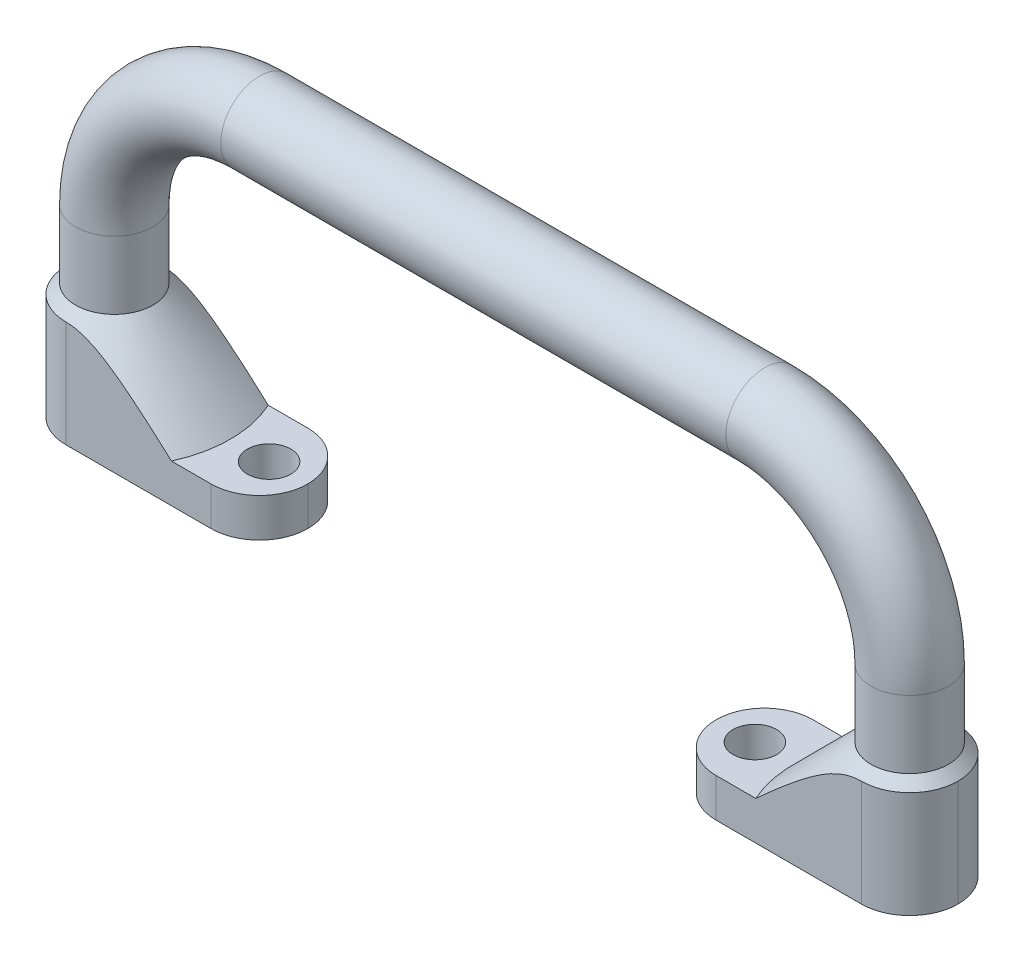
ISO-10303-21;
HEADER;
FILE_DESCRIPTION(('STEP AP214'),'2;1');
FILE_NAME('part.step','',(''),(''),'','','');
FILE_SCHEMA(('AUTOMOTIVE_DESIGN { 1 0 10303 214 1 1 1 1 }'));
ENDSEC;
DATA;
#1=APPLICATION_CONTEXT('core data for automotive mechanical design processes');
#2=APPLICATION_PROTOCOL_DEFINITION('international standard','automotive_design',2000,#1);
#3=PRODUCT_CONTEXT('',#1,'mechanical');
#4=PRODUCT('Part','Part','',(#3));
#5=PRODUCT_RELATED_PRODUCT_CATEGORY('part','',(#4));
#6=PRODUCT_DEFINITION_FORMATION('','',#4);
#7=PRODUCT_DEFINITION_CONTEXT('part definition',#1,'design');
#8=PRODUCT_DEFINITION('design','',#6,#7);
#9=PRODUCT_DEFINITION_SHAPE('','',#8);
#10=(LENGTH_UNIT() NAMED_UNIT(*) SI_UNIT(.MILLI.,.METRE.));
#11=(NAMED_UNIT(*) PLANE_ANGLE_UNIT() SI_UNIT($,.RADIAN.));
#12=(NAMED_UNIT(*) SI_UNIT($,.STERADIAN.) SOLID_ANGLE_UNIT());
#13=UNCERTAINTY_MEASURE_WITH_UNIT(LENGTH_MEASURE(1.E-05),#10,'distance_accuracy_value','');
#14=(GEOMETRIC_REPRESENTATION_CONTEXT(3) GLOBAL_UNCERTAINTY_ASSIGNED_CONTEXT((#13)) GLOBAL_UNIT_ASSIGNED_CONTEXT((#10,
#11,#12)) REPRESENTATION_CONTEXT('',''));
#15=CARTESIAN_POINT('',(0.,0.,0.));
#16=DIRECTION('',(0.,0.,1.));
#17=DIRECTION('',(1.,0.,0.));
#18=AXIS2_PLACEMENT_3D('',#15,#16,#17);
#19=CARTESIAN_POINT('',(-41.1,0.,0.));
#20=DIRECTION('',(0.,1.,0.));
#21=DIRECTION('',(0.,0.,1.));
#22=AXIS2_PLACEMENT_3D('',#19,#20,#21);
#23=CYLINDRICAL_SURFACE('',#22,4.);
#24=CARTESIAN_POINT('',(-41.1,8.00000000000006,0.));
#25=DIRECTION('',(0.,-1.,0.));
#26=DIRECTION('',(0.,0.,-1.));
#27=AXIS2_PLACEMENT_3D('',#24,#25,#26);
#28=CIRCLE('',#27,4.);
#29=CARTESIAN_POINT('',(-41.1,8.00000000000006,-4.));
#30=VERTEX_POINT('',#29);
#31=EDGE_CURVE('E246',#30,#30,#28,.F.);
#32=ORIENTED_EDGE('',*,*,#31,.T.);
#33=EDGE_LOOP('',(#32));
#34=FACE_BOUND('',#33,.T.);
#35=CARTESIAN_POINT('',(-41.1,15.,0.));
#36=DIRECTION('',(0.,-1.,0.));
#37=DIRECTION('',(0.,0.,1.));
#38=AXIS2_PLACEMENT_3D('',#35,#36,#37);
#39=CIRCLE('',#38,4.);
#40=CARTESIAN_POINT('',(-45.1,15.,0.));
#41=VERTEX_POINT('',#40);
#42=EDGE_CURVE('E334',#41,#41,#39,.T.);
#43=ORIENTED_EDGE('',*,*,#42,.T.);
#44=EDGE_LOOP('',(#43));
#45=FACE_BOUND('',#44,.T.);
#46=ADVANCED_FACE('F51',(#34,#45),#23,.T.);
#47=CARTESIAN_POINT('',(-26.1,15.,0.));
#48=DIRECTION('',(0.,0.,-1.));
#49=DIRECTION('',(-1.,0.,0.));
#50=AXIS2_PLACEMENT_3D('',#47,#48,#49);
#51=TOROIDAL_SURFACE('',#50,15.,4.);
#52=CARTESIAN_POINT('',(-26.1,30.,0.));
#53=DIRECTION('',(-1.,0.,0.));
#54=DIRECTION('',(0.,0.,1.));
#55=AXIS2_PLACEMENT_3D('',#52,#53,#54);
#56=CIRCLE('',#55,4.);
#57=CARTESIAN_POINT('',(-26.1,34.,0.));
#58=VERTEX_POINT('',#57);
#59=EDGE_CURVE('E344',#58,#58,#56,.T.);
#60=CARTESIAN_POINT('',(-26.1,15.,0.));
#61=DIRECTION('',(0.,0.,-1.));
#62=DIRECTION('',(-1.,0.,0.));
#63=AXIS2_PLACEMENT_3D('',#60,#61,#62);
#64=CIRCLE('',#63,19.);
#65=EDGE_CURVE('',#41,#58,#64,.T.);
#66=ORIENTED_EDGE('',*,*,#42,.F.);
#67=ORIENTED_EDGE('',*,*,#59,.T.);
#68=ORIENTED_EDGE('',*,*,#65,.T.);
#69=ORIENTED_EDGE('',*,*,#65,.F.);
#70=EDGE_LOOP('',(#66,#68,#67,#69));
#71=FACE_BOUND('',#70,.T.);
#72=ADVANCED_FACE('F362',(#71),#51,.T.);
#73=CARTESIAN_POINT('',(-26.1,30.,0.));
#74=DIRECTION('',(1.,0.,0.));
#75=DIRECTION('',(0.,0.,-1.));
#76=AXIS2_PLACEMENT_3D('',#73,#74,#75);
#77=CYLINDRICAL_SURFACE('',#76,4.);
#78=CARTESIAN_POINT('',(26.1,30.,0.));
#79=DIRECTION('',(-1.,0.,0.));
#80=DIRECTION('',(0.,0.,1.));
#81=AXIS2_PLACEMENT_3D('',#78,#79,#80);
#82=CIRCLE('',#81,4.);
#83=CARTESIAN_POINT('',(26.1,34.,0.));
#84=VERTEX_POINT('',#83);
#85=EDGE_CURVE('E191',#84,#84,#82,.T.);
#86=ORIENTED_EDGE('',*,*,#85,.T.);
#87=EDGE_LOOP('',(#86));
#88=FACE_BOUND('',#87,.T.);
#89=ORIENTED_EDGE('',*,*,#59,.F.);
#90=EDGE_LOOP('',(#89));
#91=FACE_BOUND('',#90,.T.);
#92=ADVANCED_FACE('F349',(#88,#91),#77,.T.);
#93=CARTESIAN_POINT('',(26.1,15.,0.));
#94=DIRECTION('',(0.,0.,-1.));
#95=DIRECTION('',(-1.,0.,0.));
#96=AXIS2_PLACEMENT_3D('',#93,#94,#95);
#97=TOROIDAL_SURFACE('',#96,15.,4.);
#98=CARTESIAN_POINT('',(41.1,15.,0.));
#99=DIRECTION('',(0.,1.,0.));
#100=DIRECTION('',(0.,0.,1.));
#101=AXIS2_PLACEMENT_3D('',#98,#99,#100);
#102=CIRCLE('',#101,4.);
#103=CARTESIAN_POINT('',(45.1,15.,0.));
#104=VERTEX_POINT('',#103);
#105=EDGE_CURVE('E187',#104,#104,#102,.T.);
#106=CARTESIAN_POINT('',(26.1,15.,0.));
#107=DIRECTION('',(0.,0.,-1.));
#108=DIRECTION('',(-1.,0.,0.));
#109=AXIS2_PLACEMENT_3D('',#106,#107,#108);
#110=CIRCLE('',#109,19.);
#111=EDGE_CURVE('',#84,#104,#110,.T.);
#112=ORIENTED_EDGE('',*,*,#85,.F.);
#113=ORIENTED_EDGE('',*,*,#105,.T.);
#114=ORIENTED_EDGE('',*,*,#111,.T.);
#115=ORIENTED_EDGE('',*,*,#111,.F.);
#116=EDGE_LOOP('',(#112,#114,#113,#115));
#117=FACE_BOUND('',#116,.T.);
#118=ADVANCED_FACE('F352',(#117),#97,.T.);
#119=CARTESIAN_POINT('',(41.1,15.,0.));
#120=DIRECTION('',(0.,-1.,0.));
#121=DIRECTION('',(0.,0.,-1.));
#122=AXIS2_PLACEMENT_3D('',#119,#120,#121);
#123=CYLINDRICAL_SURFACE('',#122,4.);
#124=CARTESIAN_POINT('',(41.1,8.00000000000013,0.));
#125=DIRECTION('',(0.,1.,0.));
#126=DIRECTION('',(0.,0.,1.));
#127=AXIS2_PLACEMENT_3D('',#124,#125,#126);
#128=CIRCLE('',#127,4.);
#129=CARTESIAN_POINT('',(41.1,8.00000000000013,4.));
#130=VERTEX_POINT('',#129);
#131=EDGE_CURVE('E230',#130,#130,#128,.T.);
#132=ORIENTED_EDGE('',*,*,#131,.T.);
#133=EDGE_LOOP('',(#132));
#134=FACE_BOUND('',#133,.T.);
#135=ORIENTED_EDGE('',*,*,#105,.F.);
#136=EDGE_LOOP('',(#135));
#137=FACE_BOUND('',#136,.T.);
#138=ADVANCED_FACE('F316',(#134,#137),#123,.T.);
#139=CARTESIAN_POINT('',(-46.1,-4.,-5.));
#140=DIRECTION('',(0.,0.,1.));
#141=DIRECTION('',(1.,0.,0.));
#142=AXIS2_PLACEMENT_3D('',#139,#140,#141);
#143=PLANE('',#142);
#144=DIRECTION('',(0.,1.,0.));
#145=VECTOR('',#144,1.);
#146=CARTESIAN_POINT('',(-41.1,-4.,-5.));
#147=LINE('',#146,#145);
#148=CARTESIAN_POINT('',(-41.1,-4.,-5.));
#149=VERTEX_POINT('',#148);
#150=CARTESIAN_POINT('',(-41.1,7.00000000000007,-5.));
#151=VERTEX_POINT('',#150);
#152=EDGE_CURVE('E68',#149,#151,#147,.T.);
#153=ORIENTED_EDGE('',*,*,#152,.T.);
#154=CARTESIAN_POINT('',(-41.1,7.00000000000007,-5.));
#155=CARTESIAN_POINT('',(-41.0230294122903,7.000006212588,-5.));
#156=CARTESIAN_POINT('',(-40.9460701463379,6.99822175880267,-5.));
#157=CARTESIAN_POINT('',(-40.7923264278984,6.99113002448274,-5.));
#158=CARTESIAN_POINT('',(-40.7155419486692,6.98582332509801,-5.));
#159=CARTESIAN_POINT('',(-40.4859880150245,6.96473858726,-5.));
#160=CARTESIAN_POINT('',(-40.3336680787708,6.94379537436098,-5.));
#161=CARTESIAN_POINT('',(-40.0342827305495,6.88976977000139,-5.));
#162=CARTESIAN_POINT('',(-39.8871726242152,6.85692905454721,-5.));
#163=CARTESIAN_POINT('',(-39.5957336733093,6.78051343459339,-5.));
#164=CARTESIAN_POINT('',(-39.4514062329731,6.73693325592776,-5.));
#165=CARTESIAN_POINT('',(-38.9967509087707,6.58360987916936,-5.));
#166=CARTESIAN_POINT('',(-38.6921976359858,6.4566212940877,-5.));
#167=CARTESIAN_POINT('',(-38.2460432625002,6.24430927336007,-5.));
#168=CARTESIAN_POINT('',(-38.098953274857,6.16980928597389,-5.));
#169=CARTESIAN_POINT('',(-37.8079510494583,6.01481711924215,-5.));
#170=CARTESIAN_POINT('',(-37.6640384455864,5.93432563499268,-5.));
#171=CARTESIAN_POINT('',(-37.3754574225301,5.76637313085827,-5.));
#172=CARTESIAN_POINT('',(-37.2308624789682,5.67878709092201,-5.));
#173=CARTESIAN_POINT('',(-36.9442935438527,5.49942984829532,-5.));
#174=CARTESIAN_POINT('',(-36.8023196158825,5.40765854426121,-5.));
#175=CARTESIAN_POINT('',(-36.5207906237873,5.22076070380414,-5.));
#176=CARTESIAN_POINT('',(-36.3812334871018,5.12563727865297,-5.));
#177=CARTESIAN_POINT('',(-36.1041069351578,4.93253318887578,-5.));
#178=CARTESIAN_POINT('',(-35.9665376048758,4.83455240263793,-5.));
#179=CARTESIAN_POINT('',(-35.5727747952042,4.54890566778743,-5.));
#180=CARTESIAN_POINT('',(-35.3187699689068,4.35822272814288,-5.));
#181=CARTESIAN_POINT('',(-34.8154861605266,3.97071556087546,-5.));
#182=CARTESIAN_POINT('',(-34.5662076086284,3.77389077849638,-5.));
#183=CARTESIAN_POINT('',(-34.0712083809918,3.3754805968975,-5.));
#184=CARTESIAN_POINT('',(-33.8254902922068,3.17389199122183,-5.));
#185=CARTESIAN_POINT('',(-33.3370231666966,2.76714897256046,-5.));
#186=CARTESIAN_POINT('',(-33.0942741870421,2.5619944912162,-5.));
#187=CARTESIAN_POINT('',(-32.6274485966861,2.1628000212204,-5.));
#188=CARTESIAN_POINT('',(-32.4032157855233,1.96894237334013,-5.));
#189=CARTESIAN_POINT('',(-31.9564752710347,1.57924540386185,-5.));
#190=CARTESIAN_POINT('',(-31.7339675909658,1.38340605562982,-5.));
#191=CARTESIAN_POINT('',(-31.2907343116188,0.990404794041007,-5.));
#192=CARTESIAN_POINT('',(-31.0700065020996,0.793245370557525,-5.));
#193=CARTESIAN_POINT('',(-30.6297807816042,0.397573990939565,-5.));
#194=CARTESIAN_POINT('',(-30.4102828254363,0.199062085104718,-5.));
#195=CARTESIAN_POINT('',(-30.1912878853641,0.,-5.));
#196=B_SPLINE_CURVE_WITH_KNOTS('',3,(#154,#155,#156,#157,#158,#159,#160,#161,#162,#163,#164,
#165,#166,#167,#168,#169,#170,#171,#172,#173,#174,#175,#176,#177,#178,#179,#180,#181,#182,#183,
#184,#185,#186,#187,#188,#189,#190,#191,#192,#193,#194,#195),.UNSPECIFIED.,.F.,.F.,(4,2,2,2,2,2,
2,2,2,2,2,2,2,2,2,2,2,2,2,2,4),(0.,0.23086945839446,0.461700834148446,0.922317600923813,
1.37405909624114,1.82602288613363,2.81309341218071,3.30768452274359,3.80221834309324,
4.30930023854729,4.81639441921608,5.32302973387091,5.82968664293459,6.78238295393183,
7.73516556684526,8.68860885582891,9.6420704427146,10.5312981282578,11.4205377809188,
12.3084132392308,13.1962558552354),.UNSPECIFIED.);
#197=CARTESIAN_POINT('',(-30.1912878853641,0.,-5.));
#198=VERTEX_POINT('',#197);
#199=EDGE_CURVE('E12',#151,#198,#196,.T.);
#200=ORIENTED_EDGE('',*,*,#199,.T.);
#201=DIRECTION('',(1.,0.,0.));
#202=VECTOR('',#201,1.);
#203=CARTESIAN_POINT('',(-46.1,0.,-5.));
#204=LINE('',#203,#202);
#205=CARTESIAN_POINT('',(-26.1,0.,-5.));
#206=VERTEX_POINT('',#205);
#207=EDGE_CURVE('E180',#198,#206,#204,.T.);
#208=ORIENTED_EDGE('',*,*,#207,.T.);
#209=DIRECTION('',(0.,1.,0.));
#210=VECTOR('',#209,1.);
#211=CARTESIAN_POINT('',(-26.1,-4.,-5.));
#212=LINE('',#211,#210);
#213=CARTESIAN_POINT('',(-26.1,-4.,-5.));
#214=VERTEX_POINT('',#213);
#215=EDGE_CURVE('E196',#206,#214,#212,.F.);
#216=ORIENTED_EDGE('',*,*,#215,.T.);
#217=DIRECTION('',(1.,0.,0.));
#218=VECTOR('',#217,1.);
#219=CARTESIAN_POINT('',(-46.1,-4.,-5.));
#220=LINE('',#219,#218);
#221=EDGE_CURVE('E179',#149,#214,#220,.T.);
#222=ORIENTED_EDGE('',*,*,#221,.F.);
#223=EDGE_LOOP('',(#153,#200,#208,#216,#222));
#224=FACE_BOUND('',#223,.T.);
#225=ADVANCED_FACE('F312',(#224),#143,.F.);
#226=CARTESIAN_POINT('',(-46.1,-4.,5.));
#227=DIRECTION('',(0.,0.,-1.));
#228=DIRECTION('',(-1.,0.,0.));
#229=AXIS2_PLACEMENT_3D('',#226,#227,#228);
#230=PLANE('',#229);
#231=DIRECTION('',(-1.,0.,0.));
#232=VECTOR('',#231,1.);
#233=CARTESIAN_POINT('',(-46.1,-4.,5.));
#234=LINE('',#233,#232);
#235=CARTESIAN_POINT('',(-26.1,-4.,5.));
#236=VERTEX_POINT('',#235);
#237=CARTESIAN_POINT('',(-41.1,-4.,5.));
#238=VERTEX_POINT('',#237);
#239=EDGE_CURVE('E163',#236,#238,#234,.T.);
#240=ORIENTED_EDGE('',*,*,#239,.F.);
#241=DIRECTION('',(0.,1.,0.));
#242=VECTOR('',#241,1.);
#243=CARTESIAN_POINT('',(-26.1,-4.,5.));
#244=LINE('',#243,#242);
#245=CARTESIAN_POINT('',(-26.1,0.,5.));
#246=VERTEX_POINT('',#245);
#247=EDGE_CURVE('E157',#236,#246,#244,.T.);
#248=ORIENTED_EDGE('',*,*,#247,.T.);
#249=DIRECTION('',(-1.,0.,0.));
#250=VECTOR('',#249,1.);
#251=CARTESIAN_POINT('',(-46.1,0.,5.));
#252=LINE('',#251,#250);
#253=CARTESIAN_POINT('',(-30.1912878853641,0.,5.));
#254=VERTEX_POINT('',#253);
#255=EDGE_CURVE('E161',#246,#254,#252,.T.);
#256=ORIENTED_EDGE('',*,*,#255,.T.);
#257=CARTESIAN_POINT('',(-30.1912878853641,0.,5.));
#258=CARTESIAN_POINT('',(-30.3844774102617,0.175610575889363,5.));
#259=CARTESIAN_POINT('',(-30.5780612268407,0.350789250330137,5.));
#260=CARTESIAN_POINT('',(-30.9661646305847,0.700114788725288,5.));
#261=CARTESIAN_POINT('',(-31.1606842371717,0.874261631095474,5.));
#262=CARTESIAN_POINT('',(-31.5509157488101,1.22145259831037,5.));
#263=CARTESIAN_POINT('',(-31.7466283009263,1.39449599648729,5.));
#264=CARTESIAN_POINT('',(-32.1393112905255,1.7391481010635,5.));
#265=CARTESIAN_POINT('',(-32.3362817197106,1.91075681690975,5.));
#266=CARTESIAN_POINT('',(-32.7332861690473,2.25362613635354,5.));
#267=CARTESIAN_POINT('',(-32.9333320918428,2.42487297292356,5.));
#268=CARTESIAN_POINT('',(-33.3352119121215,2.76525488095739,5.));
#269=CARTESIAN_POINT('',(-33.5370457943226,2.93438997044114,5.));
#270=CARTESIAN_POINT('',(-33.9428106224551,3.27003116528826,5.));
#271=CARTESIAN_POINT('',(-34.1467410563235,3.43653788854594,5.));
#272=CARTESIAN_POINT('',(-34.5571906265008,3.76632366407009,5.));
#273=CARTESIAN_POINT('',(-34.7637096891347,3.92960280785726,5.));
#274=CARTESIAN_POINT('',(-35.2084137535881,4.27417521162821,5.));
#275=CARTESIAN_POINT('',(-35.4470620109162,4.45487308282761,5.));
#276=CARTESIAN_POINT('',(-35.9295901750875,4.80929107784898,5.));
#277=CARTESIAN_POINT('',(-36.1734711195921,4.98300979768946,5.));
#278=CARTESIAN_POINT('',(-36.6680130995735,5.32093903576123,5.));
#279=CARTESIAN_POINT('',(-36.9186785243637,5.4851431717095,5.));
#280=CARTESIAN_POINT('',(-37.4284030330424,5.79997074370012,5.));
#281=CARTESIAN_POINT('',(-37.6874585953272,5.95059977973847,5.));
#282=CARTESIAN_POINT('',(-38.120197344882,6.1811501869295,5.));
#283=CARTESIAN_POINT('',(-38.2907610573371,6.26689992582624,5.));
#284=CARTESIAN_POINT('',(-38.6367147375484,6.42825547181651,5.));
#285=CARTESIAN_POINT('',(-38.8121055927343,6.50385939847199,5.));
#286=CARTESIAN_POINT('',(-39.1668557821157,6.64177900287504,5.));
#287=CARTESIAN_POINT('',(-39.346183850181,6.70417399970965,5.));
#288=CARTESIAN_POINT('',(-39.7095126716224,6.81314293359673,5.));
#289=CARTESIAN_POINT('',(-39.893509546456,6.85972956877261,5.));
#290=CARTESIAN_POINT('',(-40.2467658787609,6.93036725896863,5.));
#291=CARTESIAN_POINT('',(-40.4156596959833,6.95620565398697,5.));
#292=CARTESIAN_POINT('',(-40.670845055428,6.98233871207547,5.));
#293=CARTESIAN_POINT('',(-40.7565196023915,6.98894636424358,5.));
#294=CARTESIAN_POINT('',(-40.9281242977649,6.99778284671986,5.));
#295=CARTESIAN_POINT('',(-41.0140545267345,7.00001010777505,5.));
#296=CARTESIAN_POINT('',(-41.1,7.00000000000007,5.));
#297=B_SPLINE_CURVE_WITH_KNOTS('',3,(#257,#258,#259,#260,#261,#262,#263,#264,#265,#266,#267,
#268,#269,#270,#271,#272,#273,#274,#275,#276,#277,#278,#279,#280,#281,#282,#283,#284,#285,#286,
#287,#288,#289,#290,#291,#292,#293,#294,#295,#296),.UNSPECIFIED.,.F.,.F.,(4,2,2,2,2,2,2,2,2,2,2,
2,2,2,2,2,2,2,2,4),(0.,0.783232592101637,1.56648151067441,2.35020177817889,3.13391688104594,
3.92390149491755,4.71387936308292,5.50366866578477,6.29343554112993,7.19136312688662,
8.08947045151839,8.98817340427128,9.88650391097088,10.4589666566027,11.0315353571172,
11.6005616338825,12.1691297502474,12.6808561800538,12.9385427296536,13.1963215773543),.UNSPECIFIED.);
#298=CARTESIAN_POINT('',(-41.1,7.00000000000007,5.));
#299=VERTEX_POINT('',#298);
#300=EDGE_CURVE('E282',#254,#299,#297,.T.);
#301=ORIENTED_EDGE('',*,*,#300,.T.);
#302=DIRECTION('',(0.,1.,0.));
#303=VECTOR('',#302,1.);
#304=CARTESIAN_POINT('',(-41.1,-4.,5.));
#305=LINE('',#304,#303);
#306=EDGE_CURVE('E168',#299,#238,#305,.F.);
#307=ORIENTED_EDGE('',*,*,#306,.T.);
#308=EDGE_LOOP('',(#240,#248,#256,#301,#307));
#309=FACE_BOUND('',#308,.T.);
#310=ADVANCED_FACE('F159',(#309),#230,.F.);
#311=CARTESIAN_POINT('',(0.,-4.,0.));
#312=DIRECTION('',(0.,-1.,0.));
#313=DIRECTION('',(0.,0.,-1.));
#314=AXIS2_PLACEMENT_3D('',#311,#312,#313);
#315=PLANE('',#314);
#316=CARTESIAN_POINT('',(-25.0999999999999,-4.,0.));
#317=DIRECTION('',(0.,-1.,0.));
#318=DIRECTION('',(0.,0.,-1.));
#319=AXIS2_PLACEMENT_3D('',#316,#317,#318);
#320=CIRCLE('',#319,2.25);
#321=CARTESIAN_POINT('',(-25.0999999999999,-4.,-2.25));
#322=VERTEX_POINT('',#321);
#323=EDGE_CURVE('E600',#322,#322,#320,.T.);
#324=ORIENTED_EDGE('',*,*,#323,.F.);
#325=EDGE_LOOP('',(#324));
#326=FACE_BOUND('',#325,.T.);
#327=ORIENTED_EDGE('',*,*,#221,.T.);
#328=CARTESIAN_POINT('',(-26.1,-4.,0.));
#329=DIRECTION('',(0.,-1.,0.));
#330=DIRECTION('',(0.,0.,-1.));
#331=AXIS2_PLACEMENT_3D('',#328,#329,#330);
#332=CIRCLE('',#331,5.);
#333=CARTESIAN_POINT('',(-21.1,-4.,0.));
#334=VERTEX_POINT('',#333);
#335=EDGE_CURVE('E205',#214,#334,#332,.T.);
#336=ORIENTED_EDGE('',*,*,#335,.T.);
#337=CARTESIAN_POINT('',(-26.1,-4.,0.));
#338=DIRECTION('',(0.,-1.,0.));
#339=DIRECTION('',(0.,0.,-1.));
#340=AXIS2_PLACEMENT_3D('',#337,#338,#339);
#341=CIRCLE('',#340,5.);
#342=EDGE_CURVE('E203',#334,#236,#341,.T.);
#343=ORIENTED_EDGE('',*,*,#342,.T.);
#344=ORIENTED_EDGE('',*,*,#239,.T.);
#345=CARTESIAN_POINT('',(-41.1,-4.,0.));
#346=DIRECTION('',(0.,-1.,0.));
#347=DIRECTION('',(0.,0.,-1.));
#348=AXIS2_PLACEMENT_3D('',#345,#346,#347);
#349=CIRCLE('',#348,5.);
#350=CARTESIAN_POINT('',(-46.1,-4.,0.));
#351=VERTEX_POINT('',#350);
#352=EDGE_CURVE('E199',#238,#351,#349,.T.);
#353=ORIENTED_EDGE('',*,*,#352,.T.);
#354=CARTESIAN_POINT('',(-41.1,-4.,0.));
#355=DIRECTION('',(0.,-1.,0.));
#356=DIRECTION('',(0.,0.,-1.));
#357=AXIS2_PLACEMENT_3D('',#354,#355,#356);
#358=CIRCLE('',#357,5.);
#359=EDGE_CURVE('E201',#351,#149,#358,.T.);
#360=ORIENTED_EDGE('',*,*,#359,.T.);
#361=EDGE_LOOP('',(#327,#336,#343,#344,#353,#360));
#362=FACE_BOUND('',#361,.T.);
#363=ADVANCED_FACE('F303',(#326,#362),#315,.T.);
#364=CARTESIAN_POINT('',(0.,0.,0.));
#365=DIRECTION('',(0.,-1.,0.));
#366=DIRECTION('',(0.,0.,-1.));
#367=AXIS2_PLACEMENT_3D('',#364,#365,#366);
#368=PLANE('',#367);
#369=CARTESIAN_POINT('',(-25.0999999999999,0.,0.));
#370=DIRECTION('',(0.,1.,0.));
#371=DIRECTION('',(0.,0.,1.));
#372=AXIS2_PLACEMENT_3D('',#369,#370,#371);
#373=CIRCLE('',#372,2.25);
#374=CARTESIAN_POINT('',(-25.0999999999999,0.,2.25));
#375=VERTEX_POINT('',#374);
#376=EDGE_CURVE('E603',#375,#375,#373,.T.);
#377=ORIENTED_EDGE('',*,*,#376,.F.);
#378=EDGE_LOOP('',(#377));
#379=FACE_BOUND('',#378,.T.);
#380=ORIENTED_EDGE('',*,*,#207,.F.);
#381=CARTESIAN_POINT('',(-41.1,0.,0.));
#382=DIRECTION('',(0.,-1.,0.));
#383=DIRECTION('',(0.,0.,-1.));
#384=AXIS2_PLACEMENT_3D('',#381,#382,#383);
#385=CIRCLE('',#384,12.0000000000001);
#386=EDGE_CURVE('E178',#198,#254,#385,.T.);
#387=ORIENTED_EDGE('',*,*,#386,.T.);
#388=ORIENTED_EDGE('',*,*,#255,.F.);
#389=CARTESIAN_POINT('',(-26.1,0.,0.));
#390=DIRECTION('',(0.,-1.,0.));
#391=DIRECTION('',(0.,0.,-1.));
#392=AXIS2_PLACEMENT_3D('',#389,#390,#391);
#393=CIRCLE('',#392,5.);
#394=CARTESIAN_POINT('',(-21.1,0.,0.));
#395=VERTEX_POINT('',#394);
#396=EDGE_CURVE('E175',#246,#395,#393,.F.);
#397=ORIENTED_EDGE('',*,*,#396,.T.);
#398=CARTESIAN_POINT('',(-26.1,0.,0.));
#399=DIRECTION('',(0.,-1.,0.));
#400=DIRECTION('',(0.,0.,-1.));
#401=AXIS2_PLACEMENT_3D('',#398,#399,#400);
#402=CIRCLE('',#401,5.);
#403=EDGE_CURVE('E186',#395,#206,#402,.F.);
#404=ORIENTED_EDGE('',*,*,#403,.T.);
#405=EDGE_LOOP('',(#380,#387,#388,#397,#404));
#406=FACE_BOUND('',#405,.T.);
#407=ADVANCED_FACE('F173',(#379,#406),#368,.F.);
#408=CARTESIAN_POINT('',(21.1,-4.,-5.));
#409=DIRECTION('',(0.,0.,1.));
#410=DIRECTION('',(1.,0.,0.));
#411=AXIS2_PLACEMENT_3D('',#408,#409,#410);
#412=PLANE('',#411);
#413=DIRECTION('',(1.,0.,0.));
#414=VECTOR('',#413,1.);
#415=CARTESIAN_POINT('',(21.1,-4.,-5.));
#416=LINE('',#415,#414);
#417=CARTESIAN_POINT('',(26.1,-4.,-5.));
#418=VERTEX_POINT('',#417);
#419=CARTESIAN_POINT('',(41.1,-4.,-5.));
#420=VERTEX_POINT('',#419);
#421=EDGE_CURVE('E337',#418,#420,#416,.T.);
#422=ORIENTED_EDGE('',*,*,#421,.F.);
#423=DIRECTION('',(0.,1.,0.));
#424=VECTOR('',#423,1.);
#425=CARTESIAN_POINT('',(26.1,-4.,-5.));
#426=LINE('',#425,#424);
#427=CARTESIAN_POINT('',(26.1,0.,-5.));
#428=VERTEX_POINT('',#427);
#429=EDGE_CURVE('E210',#418,#428,#426,.T.);
#430=ORIENTED_EDGE('',*,*,#429,.T.);
#431=DIRECTION('',(1.,0.,0.));
#432=VECTOR('',#431,1.);
#433=CARTESIAN_POINT('',(21.1,0.,-5.));
#434=LINE('',#433,#432);
#435=CARTESIAN_POINT('',(30.1912878853642,0.,-5.));
#436=VERTEX_POINT('',#435);
#437=EDGE_CURVE('E340',#428,#436,#434,.T.);
#438=ORIENTED_EDGE('',*,*,#437,.T.);
#439=CARTESIAN_POINT('',(30.1912878853642,0.,-5.));
#440=CARTESIAN_POINT('',(30.3844774102618,0.175610575889364,-5.));
#441=CARTESIAN_POINT('',(30.5780612268408,0.350789250330137,-5.));
#442=CARTESIAN_POINT('',(30.9661646305847,0.700114788725284,-5.));
#443=CARTESIAN_POINT('',(31.1606842371717,0.874261631095467,-5.));
#444=CARTESIAN_POINT('',(31.5509157488102,1.22145259831036,-5.));
#445=CARTESIAN_POINT('',(31.7466283009264,1.39449599648729,-5.));
#446=CARTESIAN_POINT('',(32.1393112905256,1.7391481010635,-5.));
#447=CARTESIAN_POINT('',(32.3362817197106,1.91075681690974,-5.));
#448=CARTESIAN_POINT('',(32.7332861690474,2.25362613635353,-5.));
#449=CARTESIAN_POINT('',(32.9333320918428,2.42487297292355,-5.));
#450=CARTESIAN_POINT('',(33.3352119121216,2.76525488095737,-5.));
#451=CARTESIAN_POINT('',(33.5370457943226,2.93438997044112,-5.));
#452=CARTESIAN_POINT('',(33.9428106224551,3.27003116528824,-5.));
#453=CARTESIAN_POINT('',(34.1467410563235,3.43653788854593,-5.));
#454=CARTESIAN_POINT('',(34.5571906265007,3.76632366407007,-5.));
#455=CARTESIAN_POINT('',(34.7637096891347,3.92960280785725,-5.));
#456=CARTESIAN_POINT('',(35.2084137535881,4.27417521162819,-5.));
#457=CARTESIAN_POINT('',(35.4470620109162,4.45487308282759,-5.));
#458=CARTESIAN_POINT('',(35.9295901750875,4.80929107784896,-5.));
#459=CARTESIAN_POINT('',(36.173471119592,4.98300979768945,-5.));
#460=CARTESIAN_POINT('',(36.6680130995735,5.32093903576122,-5.));
#461=CARTESIAN_POINT('',(36.9186785243636,5.48514317170949,-5.));
#462=CARTESIAN_POINT('',(37.4284030330424,5.79997074370012,-5.));
#463=CARTESIAN_POINT('',(37.6874585953272,5.95059977973846,-5.));
#464=CARTESIAN_POINT('',(38.120197344882,6.1811501869295,-5.));
#465=CARTESIAN_POINT('',(38.290761057337,6.26689992582624,-5.));
#466=CARTESIAN_POINT('',(38.6367147375483,6.42825547181651,-5.));
#467=CARTESIAN_POINT('',(38.8121055927342,6.503859398472,-5.));
#468=CARTESIAN_POINT('',(39.1668557821157,6.64177900287506,-5.));
#469=CARTESIAN_POINT('',(39.346183850181,6.70417399970967,-5.));
#470=CARTESIAN_POINT('',(39.7095126716223,6.81314293359676,-5.));
#471=CARTESIAN_POINT('',(39.8935095464559,6.85972956877264,-5.));
#472=CARTESIAN_POINT('',(40.2467658787608,6.93036725896867,-5.));
#473=CARTESIAN_POINT('',(40.4156596959832,6.95620565398701,-5.));
#474=CARTESIAN_POINT('',(40.6708450554279,6.98233871207552,-5.));
#475=CARTESIAN_POINT('',(40.7565196023915,6.98894636424363,-5.));
#476=CARTESIAN_POINT('',(40.9281242977649,6.99778284671991,-5.));
#477=CARTESIAN_POINT('',(41.0140545267345,7.0000101077751,-5.));
#478=CARTESIAN_POINT('',(41.1,7.00000000000012,-5.));
#479=B_SPLINE_CURVE_WITH_KNOTS('',3,(#439,#440,#441,#442,#443,#444,#445,#446,#447,#448,#449,
#450,#451,#452,#453,#454,#455,#456,#457,#458,#459,#460,#461,#462,#463,#464,#465,#466,#467,#468,
#469,#470,#471,#472,#473,#474,#475,#476,#477,#478),.UNSPECIFIED.,.F.,.F.,(4,2,2,2,2,2,2,2,2,2,2,
2,2,2,2,2,2,2,2,4),(0.,0.783232592101622,1.56648151067439,2.35020177817886,3.1339168810459,
3.92390149491749,4.71387936308284,5.50366866578468,6.29343554112983,7.19136312688652,
8.08947045151827,8.98817340427116,9.88650391097075,10.4589666566026,11.0315353571171,
11.6005616338824,12.1691297502472,12.6808561800537,12.9385427296535,13.1963215773543),.UNSPECIFIED.);
#480=CARTESIAN_POINT('',(41.1,7.00000000000012,-5.));
#481=VERTEX_POINT('',#480);
#482=EDGE_CURVE('E249',#436,#481,#479,.T.);
#483=ORIENTED_EDGE('',*,*,#482,.T.);
#484=DIRECTION('',(0.,1.,0.));
#485=VECTOR('',#484,1.);
#486=CARTESIAN_POINT('',(41.1,-4.,-5.));
#487=LINE('',#486,#485);
#488=EDGE_CURVE('E167',#481,#420,#487,.F.);
#489=ORIENTED_EDGE('',*,*,#488,.T.);
#490=EDGE_LOOP('',(#422,#430,#438,#483,#489));
#491=FACE_BOUND('',#490,.T.);
#492=ADVANCED_FACE('F259',(#491),#412,.F.);
#493=CARTESIAN_POINT('',(21.1,-4.,5.));
#494=DIRECTION('',(0.,0.,-1.));
#495=DIRECTION('',(-1.,0.,0.));
#496=AXIS2_PLACEMENT_3D('',#493,#494,#495);
#497=PLANE('',#496);
#498=DIRECTION('',(0.,1.,0.));
#499=VECTOR('',#498,1.);
#500=CARTESIAN_POINT('',(41.1,-4.,5.));
#501=LINE('',#500,#499);
#502=CARTESIAN_POINT('',(41.1,-4.,5.));
#503=VERTEX_POINT('',#502);
#504=CARTESIAN_POINT('',(41.1,7.00000000000012,5.));
#505=VERTEX_POINT('',#504);
#506=EDGE_CURVE('E226',#503,#505,#501,.T.);
#507=ORIENTED_EDGE('',*,*,#506,.T.);
#508=CARTESIAN_POINT('',(41.1,7.00000000000012,5.));
#509=CARTESIAN_POINT('',(41.0230294122903,7.00000621258805,5.));
#510=CARTESIAN_POINT('',(40.946070146338,6.99822175880272,5.));
#511=CARTESIAN_POINT('',(40.7923264278985,6.9911300244828,5.));
#512=CARTESIAN_POINT('',(40.7155419486693,6.98582332509807,5.));
#513=CARTESIAN_POINT('',(40.4859880150245,6.96473858726005,5.));
#514=CARTESIAN_POINT('',(40.3336680787708,6.94379537436104,5.));
#515=CARTESIAN_POINT('',(40.0342827305496,6.88976977000144,5.));
#516=CARTESIAN_POINT('',(39.8871726242152,6.85692905454727,5.));
#517=CARTESIAN_POINT('',(39.5957336733093,6.78051343459345,5.));
#518=CARTESIAN_POINT('',(39.4514062329732,6.73693325592782,5.));
#519=CARTESIAN_POINT('',(38.9967509087707,6.58360987916942,5.));
#520=CARTESIAN_POINT('',(38.6921976359858,6.45662129408777,5.));
#521=CARTESIAN_POINT('',(38.2460432625003,6.24430927336014,5.));
#522=CARTESIAN_POINT('',(38.0989532748571,6.16980928597396,5.));
#523=CARTESIAN_POINT('',(37.8079510494584,6.01481711924223,5.));
#524=CARTESIAN_POINT('',(37.6640384455865,5.93432563499276,5.));
#525=CARTESIAN_POINT('',(37.3754574225302,5.76637313085836,5.));
#526=CARTESIAN_POINT('',(37.2308624789683,5.67878709092209,5.));
#527=CARTESIAN_POINT('',(36.9442935438528,5.49942984829542,5.));
#528=CARTESIAN_POINT('',(36.8023196158826,5.40765854426131,5.));
#529=CARTESIAN_POINT('',(36.5207906237874,5.22076070380424,5.));
#530=CARTESIAN_POINT('',(36.3812334871019,5.12563727865308,5.));
#531=CARTESIAN_POINT('',(36.1041069351579,4.93253318887589,5.));
#532=CARTESIAN_POINT('',(35.9665376048759,4.83455240263804,5.));
#533=CARTESIAN_POINT('',(35.5727747952043,4.54890566778754,5.));
#534=CARTESIAN_POINT('',(35.3187699689069,4.35822272814299,5.));
#535=CARTESIAN_POINT('',(34.8154861605268,3.97071556087556,5.));
#536=CARTESIAN_POINT('',(34.5662076086285,3.77389077849647,5.));
#537=CARTESIAN_POINT('',(34.0712083809919,3.37548059689759,5.));
#538=CARTESIAN_POINT('',(33.8254902922069,3.17389199122191,5.));
#539=CARTESIAN_POINT('',(33.3370231666967,2.76714897256053,5.));
#540=CARTESIAN_POINT('',(33.0942741870423,2.56199449121627,5.));
#541=CARTESIAN_POINT('',(32.6274485966862,2.16280002122046,5.));
#542=CARTESIAN_POINT('',(32.4032157855234,1.96894237334018,5.));
#543=CARTESIAN_POINT('',(31.9564752710348,1.57924540386189,5.));
#544=CARTESIAN_POINT('',(31.7339675909659,1.38340605562985,5.));
#545=CARTESIAN_POINT('',(31.290734311619,0.990404794041031,5.));
#546=CARTESIAN_POINT('',(31.0700065020997,0.793245370557546,5.));
#547=CARTESIAN_POINT('',(30.6297807816043,0.397573990939578,5.));
#548=CARTESIAN_POINT('',(30.4102828254364,0.199062085104724,5.));
#549=CARTESIAN_POINT('',(30.1912878853642,0.,5.));
#550=B_SPLINE_CURVE_WITH_KNOTS('',3,(#508,#509,#510,#511,#512,#513,#514,#515,#516,#517,#518,
#519,#520,#521,#522,#523,#524,#525,#526,#527,#528,#529,#530,#531,#532,#533,#534,#535,#536,#537,
#538,#539,#540,#541,#542,#543,#544,#545,#546,#547,#548,#549),.UNSPECIFIED.,.F.,.F.,(4,2,2,2,2,2,
2,2,2,2,2,2,2,2,2,2,2,2,2,2,4),(0.,0.230869458394453,0.461700834148432,0.922317600923785,
1.3740590962411,1.8260228861336,2.81309341218065,3.30768452274351,3.80221834309313,
4.30930023854717,4.81639441921595,5.32302973387077,5.82968664293442,6.78238295393168,
7.73516556684513,8.68860885582878,9.6420704427145,10.5312981282577,11.4205377809187,
12.3084132392307,13.1962558552354),.UNSPECIFIED.);
#551=CARTESIAN_POINT('',(30.1912878853642,0.,5.));
#552=VERTEX_POINT('',#551);
#553=EDGE_CURVE('E276',#505,#552,#550,.T.);
#554=ORIENTED_EDGE('',*,*,#553,.T.);
#555=DIRECTION('',(-1.,0.,0.));
#556=VECTOR('',#555,1.);
#557=CARTESIAN_POINT('',(21.1,0.,5.));
#558=LINE('',#557,#556);
#559=CARTESIAN_POINT('',(26.1,0.,5.));
#560=VERTEX_POINT('',#559);
#561=EDGE_CURVE('E610',#552,#560,#558,.T.);
#562=ORIENTED_EDGE('',*,*,#561,.T.);
#563=DIRECTION('',(0.,1.,0.));
#564=VECTOR('',#563,1.);
#565=CARTESIAN_POINT('',(26.1,-4.,5.));
#566=LINE('',#565,#564);
#567=CARTESIAN_POINT('',(26.1,-4.,5.));
#568=VERTEX_POINT('',#567);
#569=EDGE_CURVE('E228',#560,#568,#566,.F.);
#570=ORIENTED_EDGE('',*,*,#569,.T.);
#571=DIRECTION('',(-1.,0.,0.));
#572=VECTOR('',#571,1.);
#573=CARTESIAN_POINT('',(21.1,-4.,5.));
#574=LINE('',#573,#572);
#575=EDGE_CURVE('E232',#503,#568,#574,.T.);
#576=ORIENTED_EDGE('',*,*,#575,.F.);
#577=EDGE_LOOP('',(#507,#554,#562,#570,#576));
#578=FACE_BOUND('',#577,.T.);
#579=ADVANCED_FACE('F290',(#578),#497,.F.);
#580=CARTESIAN_POINT('',(0.,-4.,0.));
#581=DIRECTION('',(0.,1.,0.));
#582=DIRECTION('',(0.,0.,1.));
#583=AXIS2_PLACEMENT_3D('',#580,#581,#582);
#584=PLANE('',#583);
#585=CARTESIAN_POINT('',(25.1,-4.,0.));
#586=DIRECTION('',(0.,1.,0.));
#587=DIRECTION('',(0.,0.,1.));
#588=AXIS2_PLACEMENT_3D('',#585,#586,#587);
#589=CIRCLE('',#588,2.25);
#590=CARTESIAN_POINT('',(25.1,-4.,2.25));
#591=VERTEX_POINT('',#590);
#592=EDGE_CURVE('E57',#591,#591,#589,.T.);
#593=ORIENTED_EDGE('',*,*,#592,.T.);
#594=EDGE_LOOP('',(#593));
#595=FACE_BOUND('',#594,.T.);
#596=CARTESIAN_POINT('',(26.1,-4.,0.));
#597=DIRECTION('',(0.,1.,0.));
#598=DIRECTION('',(0.,0.,1.));
#599=AXIS2_PLACEMENT_3D('',#596,#597,#598);
#600=CIRCLE('',#599,5.);
#601=CARTESIAN_POINT('',(21.1,-4.,0.));
#602=VERTEX_POINT('',#601);
#603=EDGE_CURVE('E222',#568,#602,#600,.F.);
#604=ORIENTED_EDGE('',*,*,#603,.T.);
#605=CARTESIAN_POINT('',(26.1,-4.,0.));
#606=DIRECTION('',(0.,1.,0.));
#607=DIRECTION('',(0.,0.,1.));
#608=AXIS2_PLACEMENT_3D('',#605,#606,#607);
#609=CIRCLE('',#608,5.);
#610=EDGE_CURVE('E224',#602,#418,#609,.F.);
#611=ORIENTED_EDGE('',*,*,#610,.T.);
#612=ORIENTED_EDGE('',*,*,#421,.T.);
#613=CARTESIAN_POINT('',(41.1,-4.,0.));
#614=DIRECTION('',(0.,1.,0.));
#615=DIRECTION('',(0.,0.,1.));
#616=AXIS2_PLACEMENT_3D('',#613,#614,#615);
#617=CIRCLE('',#616,5.);
#618=CARTESIAN_POINT('',(46.1,-4.,0.));
#619=VERTEX_POINT('',#618);
#620=EDGE_CURVE('E220',#420,#619,#617,.F.);
#621=ORIENTED_EDGE('',*,*,#620,.T.);
#622=CARTESIAN_POINT('',(41.1,-4.,0.));
#623=DIRECTION('',(0.,1.,0.));
#624=DIRECTION('',(0.,0.,1.));
#625=AXIS2_PLACEMENT_3D('',#622,#623,#624);
#626=CIRCLE('',#625,5.);
#627=EDGE_CURVE('E218',#619,#503,#626,.F.);
#628=ORIENTED_EDGE('',*,*,#627,.T.);
#629=ORIENTED_EDGE('',*,*,#575,.T.);
#630=EDGE_LOOP('',(#604,#611,#612,#621,#628,#629));
#631=FACE_BOUND('',#630,.T.);
#632=ADVANCED_FACE('F294',(#595,#631),#584,.F.);
#633=CARTESIAN_POINT('',(0.,0.,0.));
#634=DIRECTION('',(0.,1.,0.));
#635=DIRECTION('',(0.,0.,1.));
#636=AXIS2_PLACEMENT_3D('',#633,#634,#635);
#637=PLANE('',#636);
#638=CARTESIAN_POINT('',(25.1,0.,0.));
#639=DIRECTION('',(0.,1.,0.));
#640=DIRECTION('',(0.,0.,1.));
#641=AXIS2_PLACEMENT_3D('',#638,#639,#640);
#642=CIRCLE('',#641,2.25);
#643=CARTESIAN_POINT('',(25.1,0.,2.25));
#644=VERTEX_POINT('',#643);
#645=EDGE_CURVE('E605',#644,#644,#642,.T.);
#646=ORIENTED_EDGE('',*,*,#645,.F.);
#647=EDGE_LOOP('',(#646));
#648=FACE_BOUND('',#647,.T.);
#649=ORIENTED_EDGE('',*,*,#561,.F.);
#650=CARTESIAN_POINT('',(41.1,0.,0.));
#651=DIRECTION('',(0.,1.,0.));
#652=DIRECTION('',(0.,0.,1.));
#653=AXIS2_PLACEMENT_3D('',#650,#651,#652);
#654=CIRCLE('',#653,12.0000000000001);
#655=EDGE_CURVE('E242',#552,#436,#654,.F.);
#656=ORIENTED_EDGE('',*,*,#655,.T.);
#657=ORIENTED_EDGE('',*,*,#437,.F.);
#658=CARTESIAN_POINT('',(26.1,0.,0.));
#659=DIRECTION('',(0.,1.,0.));
#660=DIRECTION('',(0.,0.,1.));
#661=AXIS2_PLACEMENT_3D('',#658,#659,#660);
#662=CIRCLE('',#661,5.);
#663=CARTESIAN_POINT('',(21.1,0.,0.));
#664=VERTEX_POINT('',#663);
#665=EDGE_CURVE('E216',#428,#664,#662,.T.);
#666=ORIENTED_EDGE('',*,*,#665,.T.);
#667=CARTESIAN_POINT('',(26.1,0.,0.));
#668=DIRECTION('',(0.,1.,0.));
#669=DIRECTION('',(0.,0.,1.));
#670=AXIS2_PLACEMENT_3D('',#667,#668,#669);
#671=CIRCLE('',#670,5.);
#672=EDGE_CURVE('E213',#664,#560,#671,.T.);
#673=ORIENTED_EDGE('',*,*,#672,.T.);
#674=EDGE_LOOP('',(#649,#656,#657,#666,#673));
#675=FACE_BOUND('',#674,.T.);
#676=ADVANCED_FACE('F296',(#648,#675),#637,.T.);
#677=CARTESIAN_POINT('',(-26.1,-4.,0.));
#678=DIRECTION('',(0.,1.,0.));
#679=DIRECTION('',(0.,0.,1.));
#680=AXIS2_PLACEMENT_3D('',#677,#678,#679);
#681=CYLINDRICAL_SURFACE('',#680,5.);
#682=ORIENTED_EDGE('',*,*,#247,.F.);
#683=ORIENTED_EDGE('',*,*,#342,.F.);
#684=DIRECTION('',(0.,1.,0.));
#685=VECTOR('',#684,1.);
#686=CARTESIAN_POINT('',(-21.1,-4.,0.));
#687=LINE('',#686,#685);
#688=EDGE_CURVE('E184',#395,#334,#687,.F.);
#689=ORIENTED_EDGE('',*,*,#688,.F.);
#690=ORIENTED_EDGE('',*,*,#396,.F.);
#691=EDGE_LOOP('',(#682,#683,#689,#690));
#692=FACE_BOUND('',#691,.T.);
#693=ADVANCED_FACE('F182',(#692),#681,.T.);
#694=CARTESIAN_POINT('',(-26.1,-4.,0.));
#695=DIRECTION('',(0.,1.,0.));
#696=DIRECTION('',(0.,0.,1.));
#697=AXIS2_PLACEMENT_3D('',#694,#695,#696);
#698=CYLINDRICAL_SURFACE('',#697,5.);
#699=ORIENTED_EDGE('',*,*,#335,.F.);
#700=ORIENTED_EDGE('',*,*,#215,.F.);
#701=ORIENTED_EDGE('',*,*,#403,.F.);
#702=ORIENTED_EDGE('',*,*,#688,.T.);
#703=EDGE_LOOP('',(#699,#700,#701,#702));
#704=FACE_BOUND('',#703,.T.);
#705=ADVANCED_FACE('F365',(#704),#698,.T.);
#706=CARTESIAN_POINT('',(26.1,-4.,0.));
#707=DIRECTION('',(0.,1.,0.));
#708=DIRECTION('',(0.,0.,1.));
#709=AXIS2_PLACEMENT_3D('',#706,#707,#708);
#710=CYLINDRICAL_SURFACE('',#709,5.);
#711=DIRECTION('',(0.,1.,0.));
#712=VECTOR('',#711,1.);
#713=CARTESIAN_POINT('',(21.1,-4.,0.));
#714=LINE('',#713,#712);
#715=EDGE_CURVE('E233',#602,#664,#714,.T.);
#716=ORIENTED_EDGE('',*,*,#715,.F.);
#717=ORIENTED_EDGE('',*,*,#603,.F.);
#718=ORIENTED_EDGE('',*,*,#569,.F.);
#719=ORIENTED_EDGE('',*,*,#672,.F.);
#720=EDGE_LOOP('',(#716,#717,#718,#719));
#721=FACE_BOUND('',#720,.T.);
#722=ADVANCED_FACE('F368',(#721),#710,.T.);
#723=CARTESIAN_POINT('',(26.1,-4.,0.));
#724=DIRECTION('',(0.,1.,0.));
#725=DIRECTION('',(0.,0.,1.));
#726=AXIS2_PLACEMENT_3D('',#723,#724,#725);
#727=CYLINDRICAL_SURFACE('',#726,5.);
#728=ORIENTED_EDGE('',*,*,#610,.F.);
#729=ORIENTED_EDGE('',*,*,#715,.T.);
#730=ORIENTED_EDGE('',*,*,#665,.F.);
#731=ORIENTED_EDGE('',*,*,#429,.F.);
#732=EDGE_LOOP('',(#728,#729,#730,#731));
#733=FACE_BOUND('',#732,.T.);
#734=ADVANCED_FACE('F372',(#733),#727,.T.);
#735=CARTESIAN_POINT('',(41.1,-4.,0.));
#736=DIRECTION('',(0.,1.,0.));
#737=DIRECTION('',(0.,0.,1.));
#738=AXIS2_PLACEMENT_3D('',#735,#736,#737);
#739=CYLINDRICAL_SURFACE('',#738,5.);
#740=ORIENTED_EDGE('',*,*,#506,.F.);
#741=ORIENTED_EDGE('',*,*,#627,.F.);
#742=DIRECTION('',(0.,1.,0.));
#743=VECTOR('',#742,1.);
#744=CARTESIAN_POINT('',(46.1,-4.,0.));
#745=LINE('',#744,#743);
#746=CARTESIAN_POINT('',(46.1,7.00000000000012,0.));
#747=VERTEX_POINT('',#746);
#748=EDGE_CURVE('E236',#747,#619,#745,.F.);
#749=ORIENTED_EDGE('',*,*,#748,.F.);
#750=CARTESIAN_POINT('',(41.1,7.00000000000012,0.));
#751=DIRECTION('',(0.,-1.,0.));
#752=DIRECTION('',(0.,0.,-1.));
#753=AXIS2_PLACEMENT_3D('',#750,#751,#752);
#754=CIRCLE('',#753,5.);
#755=EDGE_CURVE('E283',#747,#505,#754,.T.);
#756=ORIENTED_EDGE('',*,*,#755,.T.);
#757=EDGE_LOOP('',(#740,#741,#749,#756));
#758=FACE_BOUND('',#757,.T.);
#759=ADVANCED_FACE('F375',(#758),#739,.T.);
#760=CARTESIAN_POINT('',(41.1,-4.,0.));
#761=DIRECTION('',(0.,1.,0.));
#762=DIRECTION('',(0.,0.,1.));
#763=AXIS2_PLACEMENT_3D('',#760,#761,#762);
#764=CYLINDRICAL_SURFACE('',#763,5.);
#765=ORIENTED_EDGE('',*,*,#620,.F.);
#766=ORIENTED_EDGE('',*,*,#488,.F.);
#767=CARTESIAN_POINT('',(41.1,7.00000000000012,0.));
#768=DIRECTION('',(0.,-1.,0.));
#769=DIRECTION('',(0.,0.,-1.));
#770=AXIS2_PLACEMENT_3D('',#767,#768,#769);
#771=CIRCLE('',#770,5.);
#772=EDGE_CURVE('E257',#481,#747,#771,.T.);
#773=ORIENTED_EDGE('',*,*,#772,.T.);
#774=ORIENTED_EDGE('',*,*,#748,.T.);
#775=EDGE_LOOP('',(#765,#766,#773,#774));
#776=FACE_BOUND('',#775,.T.);
#777=ADVANCED_FACE('F380',(#776),#764,.T.);
#778=CARTESIAN_POINT('',(-41.1,-4.,0.));
#779=DIRECTION('',(0.,1.,0.));
#780=DIRECTION('',(0.,0.,1.));
#781=AXIS2_PLACEMENT_3D('',#778,#779,#780);
#782=CYLINDRICAL_SURFACE('',#781,5.);
#783=DIRECTION('',(0.,1.,0.));
#784=VECTOR('',#783,1.);
#785=CARTESIAN_POINT('',(-46.1,-4.,0.));
#786=LINE('',#785,#784);
#787=CARTESIAN_POINT('',(-46.1,7.00000000000006,0.));
#788=VERTEX_POINT('',#787);
#789=EDGE_CURVE('E75',#351,#788,#786,.T.);
#790=ORIENTED_EDGE('',*,*,#789,.F.);
#791=ORIENTED_EDGE('',*,*,#352,.F.);
#792=ORIENTED_EDGE('',*,*,#306,.F.);
#793=CARTESIAN_POINT('',(-41.1,7.00000000000007,0.));
#794=DIRECTION('',(0.,-1.,0.));
#795=DIRECTION('',(0.,0.,-1.));
#796=AXIS2_PLACEMENT_3D('',#793,#794,#795);
#797=CIRCLE('',#796,5.);
#798=EDGE_CURVE('E323',#299,#788,#797,.T.);
#799=ORIENTED_EDGE('',*,*,#798,.T.);
#800=EDGE_LOOP('',(#790,#791,#792,#799));
#801=FACE_BOUND('',#800,.T.);
#802=ADVANCED_FACE('F272',(#801),#782,.T.);
#803=CARTESIAN_POINT('',(-41.1,-4.,0.));
#804=DIRECTION('',(0.,1.,0.));
#805=DIRECTION('',(0.,0.,1.));
#806=AXIS2_PLACEMENT_3D('',#803,#804,#805);
#807=CYLINDRICAL_SURFACE('',#806,5.);
#808=ORIENTED_EDGE('',*,*,#359,.F.);
#809=ORIENTED_EDGE('',*,*,#789,.T.);
#810=CARTESIAN_POINT('',(-41.1,7.00000000000007,0.));
#811=DIRECTION('',(0.,-1.,0.));
#812=DIRECTION('',(0.,0.,-1.));
#813=AXIS2_PLACEMENT_3D('',#810,#811,#812);
#814=CIRCLE('',#813,5.);
#815=EDGE_CURVE('E62',#788,#151,#814,.T.);
#816=ORIENTED_EDGE('',*,*,#815,.T.);
#817=ORIENTED_EDGE('',*,*,#152,.F.);
#818=EDGE_LOOP('',(#808,#809,#816,#817));
#819=FACE_BOUND('',#818,.T.);
#820=ADVANCED_FACE('F270',(#819),#807,.T.);
#821=CARTESIAN_POINT('',(41.1,8.00000000000013,0.));
#822=DIRECTION('',(0.,-1.,0.));
#823=DIRECTION('',(0.,0.,-1.));
#824=AXIS2_PLACEMENT_3D('',#821,#822,#823);
#825=CONICAL_SURFACE('',#824,4.,0.785398163397443);
#826=ORIENTED_EDGE('',*,*,#482,.F.);
#827=ORIENTED_EDGE('',*,*,#655,.F.);
#828=ORIENTED_EDGE('',*,*,#553,.F.);
#829=ORIENTED_EDGE('',*,*,#755,.F.);
#830=ORIENTED_EDGE('',*,*,#772,.F.);
#831=EDGE_LOOP('',(#826,#827,#828,#829,#830));
#832=FACE_BOUND('',#831,.T.);
#833=ORIENTED_EDGE('',*,*,#131,.F.);
#834=EDGE_LOOP('',(#833));
#835=FACE_BOUND('',#834,.T.);
#836=ADVANCED_FACE('F264',(#832,#835),#825,.T.);
#837=CARTESIAN_POINT('',(-41.1,0.,0.));
#838=DIRECTION('',(0.,-1.,0.));
#839=DIRECTION('',(0.,0.,-1.));
#840=AXIS2_PLACEMENT_3D('',#837,#838,#839);
#841=CONICAL_SURFACE('',#840,12.0000000000001,0.785398163397454);
#842=ORIENTED_EDGE('',*,*,#31,.F.);
#843=EDGE_LOOP('',(#842));
#844=FACE_BOUND('',#843,.T.);
#845=ORIENTED_EDGE('',*,*,#300,.F.);
#846=ORIENTED_EDGE('',*,*,#386,.F.);
#847=ORIENTED_EDGE('',*,*,#199,.F.);
#848=ORIENTED_EDGE('',*,*,#815,.F.);
#849=ORIENTED_EDGE('',*,*,#798,.F.);
#850=EDGE_LOOP('',(#845,#846,#847,#848,#849));
#851=FACE_BOUND('',#850,.T.);
#852=ADVANCED_FACE('F54',(#844,#851),#841,.T.);
#853=CARTESIAN_POINT('',(25.1,0.,0.));
#854=DIRECTION('',(0.,1.,0.));
#855=DIRECTION('',(0.,0.,1.));
#856=AXIS2_PLACEMENT_3D('',#853,#854,#855);
#857=CYLINDRICAL_SURFACE('',#856,2.25);
#858=ORIENTED_EDGE('',*,*,#645,.T.);
#859=EDGE_LOOP('',(#858));
#860=FACE_BOUND('',#859,.T.);
#861=ORIENTED_EDGE('',*,*,#592,.F.);
#862=EDGE_LOOP('',(#861));
#863=FACE_BOUND('',#862,.T.);
#864=ADVANCED_FACE('F568',(#860,#863),#857,.F.);
#865=CARTESIAN_POINT('',(-25.0999999999999,0.,0.));
#866=DIRECTION('',(0.,1.,0.));
#867=DIRECTION('',(0.,0.,1.));
#868=AXIS2_PLACEMENT_3D('',#865,#866,#867);
#869=CYLINDRICAL_SURFACE('',#868,2.25);
#870=ORIENTED_EDGE('',*,*,#323,.T.);
#871=EDGE_LOOP('',(#870));
#872=FACE_BOUND('',#871,.T.);
#873=ORIENTED_EDGE('',*,*,#376,.T.);
#874=EDGE_LOOP('',(#873));
#875=FACE_BOUND('',#874,.T.);
#876=ADVANCED_FACE('F576',(#872,#875),#869,.F.);
#877=CLOSED_SHELL('',(#46,#72,#92,#118,#138,#225,#310,#363,#407,#492,#579,#632,#676,#693,#705,
#722,#734,#759,#777,#802,#820,#836,#852,#864,#876));
#878=MANIFOLD_SOLID_BREP('B2',#877);
#879=ADVANCED_BREP_SHAPE_REPRESENTATION('',(#18,#878),#14);
#880=SHAPE_DEFINITION_REPRESENTATION(#9,#879);
ENDSEC;
END-ISO-10303-21;
